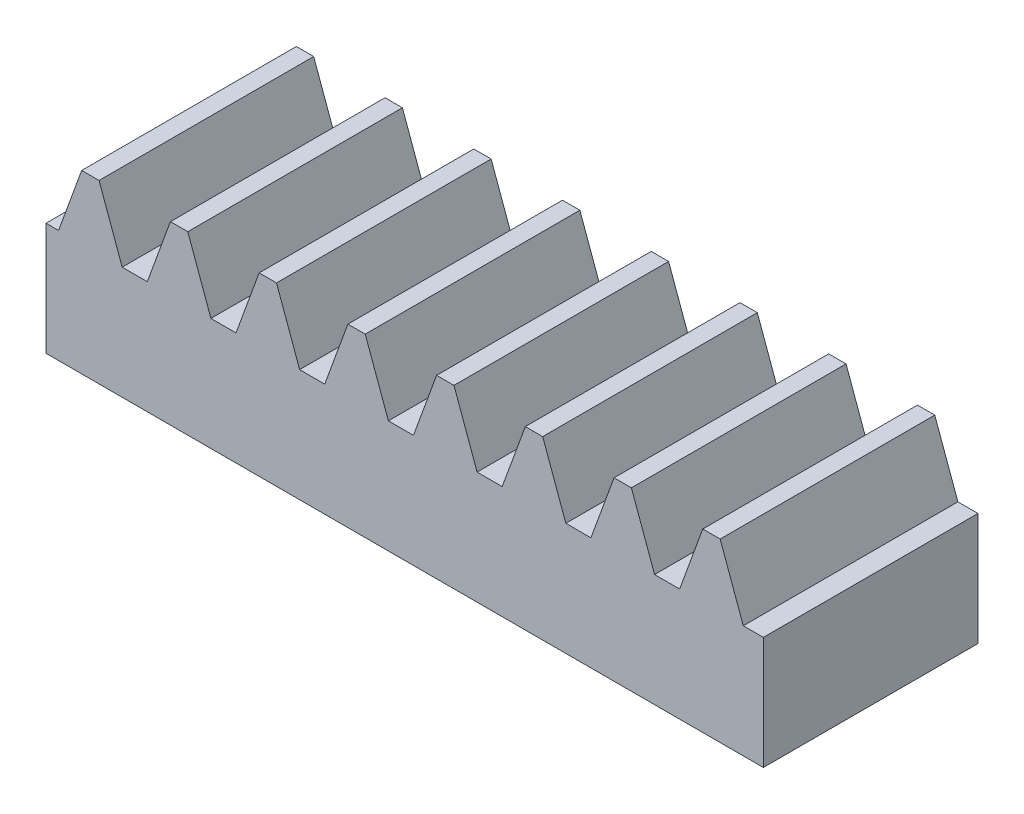
ISO-10303-21;
HEADER;
FILE_DESCRIPTION(('STEP AP214'),'2;1');
FILE_NAME('part.step','',(''),(''),'','','');
FILE_SCHEMA(('AUTOMOTIVE_DESIGN { 1 0 10303 214 1 1 1 1 }'));
ENDSEC;
DATA;
#1=APPLICATION_CONTEXT('core data for automotive mechanical design processes');
#2=APPLICATION_PROTOCOL_DEFINITION('international standard','automotive_design',2000,#1);
#3=PRODUCT_CONTEXT('',#1,'mechanical');
#4=PRODUCT('Part','Part','',(#3));
#5=PRODUCT_RELATED_PRODUCT_CATEGORY('part','',(#4));
#6=PRODUCT_DEFINITION_FORMATION('','',#4);
#7=PRODUCT_DEFINITION_CONTEXT('part definition',#1,'design');
#8=PRODUCT_DEFINITION('design','',#6,#7);
#9=PRODUCT_DEFINITION_SHAPE('','',#8);
#10=(LENGTH_UNIT() NAMED_UNIT(*) SI_UNIT(.MILLI.,.METRE.));
#11=(NAMED_UNIT(*) PLANE_ANGLE_UNIT() SI_UNIT($,.RADIAN.));
#12=(NAMED_UNIT(*) SI_UNIT($,.STERADIAN.) SOLID_ANGLE_UNIT());
#13=UNCERTAINTY_MEASURE_WITH_UNIT(LENGTH_MEASURE(1.E-05),#10,'distance_accuracy_value','');
#14=(GEOMETRIC_REPRESENTATION_CONTEXT(3) GLOBAL_UNCERTAINTY_ASSIGNED_CONTEXT((#13)) GLOBAL_UNIT_ASSIGNED_CONTEXT((#10,
#11,#12)) REPRESENTATION_CONTEXT('',''));
#15=CARTESIAN_POINT('',(0.,0.,0.));
#16=DIRECTION('',(0.,0.,1.));
#17=DIRECTION('',(1.,0.,0.));
#18=AXIS2_PLACEMENT_3D('',#15,#16,#17);
#19=CARTESIAN_POINT('',(0.,3.12,-3.8));
#20=DIRECTION('',(0.,1.,0.));
#21=DIRECTION('',(0.,0.,1.));
#22=AXIS2_PLACEMENT_3D('',#19,#20,#21);
#23=PLANE('',#22);
#24=DIRECTION('',(0.,0.,1.));
#25=VECTOR('',#24,1.);
#26=CARTESIAN_POINT('',(10.3638900766169,3.12,-3.8));
#27=LINE('',#26,#25);
#28=CARTESIAN_POINT('',(10.3638900766169,3.12,-3.8));
#29=VERTEX_POINT('',#28);
#30=CARTESIAN_POINT('',(10.3638900766169,3.12,0.));
#31=VERTEX_POINT('',#30);
#32=EDGE_CURVE('E310',#29,#31,#27,.T.);
#33=ORIENTED_EDGE('',*,*,#32,.F.);
#34=DIRECTION('',(-1.,0.,0.));
#35=VECTOR('',#34,1.);
#36=CARTESIAN_POINT('',(0.,3.12,-3.8));
#37=LINE('',#36,#35);
#38=CARTESIAN_POINT('',(10.0564621483831,3.12,-3.8));
#39=VERTEX_POINT('',#38);
#40=EDGE_CURVE('E485',#29,#39,#37,.T.);
#41=ORIENTED_EDGE('',*,*,#40,.T.);
#42=DIRECTION('',(0.,0.,-1.));
#43=VECTOR('',#42,1.);
#44=CARTESIAN_POINT('',(10.0564621483831,3.12,-3.8));
#45=LINE('',#44,#43);
#46=CARTESIAN_POINT('',(10.0564621483831,3.12,0.));
#47=VERTEX_POINT('',#46);
#48=EDGE_CURVE('E330',#47,#39,#45,.T.);
#49=ORIENTED_EDGE('',*,*,#48,.F.);
#50=DIRECTION('',(-1.,0.,0.));
#51=VECTOR('',#50,1.);
#52=CARTESIAN_POINT('',(0.,3.12,0.));
#53=LINE('',#52,#51);
#54=EDGE_CURVE('E495',#31,#47,#53,.T.);
#55=ORIENTED_EDGE('',*,*,#54,.F.);
#56=EDGE_LOOP('',(#33,#41,#49,#55));
#57=FACE_BOUND('',#56,.T.);
#58=ADVANCED_FACE('F33',(#57),#23,.T.);
#59=DIRECTION('',(0.,0.,1.));
#60=VECTOR('',#59,1.);
#61=CARTESIAN_POINT('',(8.79309375161691,3.12,-3.8));
#62=LINE('',#61,#60);
#63=CARTESIAN_POINT('',(8.79309375161691,3.12,-3.8));
#64=VERTEX_POINT('',#63);
#65=CARTESIAN_POINT('',(8.79309375161691,3.12,0.));
#66=VERTEX_POINT('',#65);
#67=EDGE_CURVE('E334',#64,#66,#62,.T.);
#68=ORIENTED_EDGE('',*,*,#67,.F.);
#69=CARTESIAN_POINT('',(8.4856658233831,3.12,-3.8));
#70=VERTEX_POINT('',#69);
#71=EDGE_CURVE('E575',#64,#70,#37,.T.);
#72=ORIENTED_EDGE('',*,*,#71,.T.);
#73=DIRECTION('',(0.,0.,-1.));
#74=VECTOR('',#73,1.);
#75=CARTESIAN_POINT('',(8.4856658233831,3.12,-3.8));
#76=LINE('',#75,#74);
#77=CARTESIAN_POINT('',(8.4856658233831,3.12,0.));
#78=VERTEX_POINT('',#77);
#79=EDGE_CURVE('E354',#78,#70,#76,.T.);
#80=ORIENTED_EDGE('',*,*,#79,.F.);
#81=EDGE_CURVE('E532',#66,#78,#53,.T.);
#82=ORIENTED_EDGE('',*,*,#81,.F.);
#83=EDGE_LOOP('',(#68,#72,#80,#82));
#84=FACE_BOUND('',#83,.T.);
#85=ADVANCED_FACE('F593',(#84),#23,.T.);
#86=DIRECTION('',(0.,0.,1.));
#87=VECTOR('',#86,1.);
#88=CARTESIAN_POINT('',(7.22229742661691,3.12,-3.8));
#89=LINE('',#88,#87);
#90=CARTESIAN_POINT('',(7.22229742661691,3.12,-3.8));
#91=VERTEX_POINT('',#90);
#92=CARTESIAN_POINT('',(7.22229742661691,3.12,0.));
#93=VERTEX_POINT('',#92);
#94=EDGE_CURVE('E358',#91,#93,#89,.T.);
#95=ORIENTED_EDGE('',*,*,#94,.F.);
#96=CARTESIAN_POINT('',(6.9148694983831,3.12,-3.8));
#97=VERTEX_POINT('',#96);
#98=EDGE_CURVE('E570',#91,#97,#37,.T.);
#99=ORIENTED_EDGE('',*,*,#98,.T.);
#100=DIRECTION('',(0.,0.,-1.));
#101=VECTOR('',#100,1.);
#102=CARTESIAN_POINT('',(6.9148694983831,3.12,-3.8));
#103=LINE('',#102,#101);
#104=CARTESIAN_POINT('',(6.9148694983831,3.12,0.));
#105=VERTEX_POINT('',#104);
#106=EDGE_CURVE('E378',#105,#97,#103,.T.);
#107=ORIENTED_EDGE('',*,*,#106,.F.);
#108=EDGE_CURVE('E533',#93,#105,#53,.T.);
#109=ORIENTED_EDGE('',*,*,#108,.F.);
#110=EDGE_LOOP('',(#95,#99,#107,#109));
#111=FACE_BOUND('',#110,.T.);
#112=ADVANCED_FACE('F603',(#111),#23,.T.);
#113=DIRECTION('',(0.,0.,1.));
#114=VECTOR('',#113,1.);
#115=CARTESIAN_POINT('',(5.65150110161691,3.12,-3.8));
#116=LINE('',#115,#114);
#117=CARTESIAN_POINT('',(5.65150110161691,3.12,-3.8));
#118=VERTEX_POINT('',#117);
#119=CARTESIAN_POINT('',(5.65150110161691,3.12,0.));
#120=VERTEX_POINT('',#119);
#121=EDGE_CURVE('E382',#118,#120,#116,.T.);
#122=ORIENTED_EDGE('',*,*,#121,.F.);
#123=CARTESIAN_POINT('',(5.3440731733831,3.12,-3.8));
#124=VERTEX_POINT('',#123);
#125=EDGE_CURVE('E565',#118,#124,#37,.T.);
#126=ORIENTED_EDGE('',*,*,#125,.T.);
#127=DIRECTION('',(0.,0.,-1.));
#128=VECTOR('',#127,1.);
#129=CARTESIAN_POINT('',(5.34407317338309,3.12,-3.8));
#130=LINE('',#129,#128);
#131=CARTESIAN_POINT('',(5.3440731733831,3.12,0.));
#132=VERTEX_POINT('',#131);
#133=EDGE_CURVE('E402',#132,#124,#130,.T.);
#134=ORIENTED_EDGE('',*,*,#133,.F.);
#135=EDGE_CURVE('E536',#120,#132,#53,.T.);
#136=ORIENTED_EDGE('',*,*,#135,.F.);
#137=EDGE_LOOP('',(#122,#126,#134,#136));
#138=FACE_BOUND('',#137,.T.);
#139=ADVANCED_FACE('F613',(#138),#23,.T.);
#140=DIRECTION('',(0.,0.,1.));
#141=VECTOR('',#140,1.);
#142=CARTESIAN_POINT('',(4.08070477661691,3.12,-3.8));
#143=LINE('',#142,#141);
#144=CARTESIAN_POINT('',(4.08070477661691,3.12,-3.8));
#145=VERTEX_POINT('',#144);
#146=CARTESIAN_POINT('',(4.08070477661691,3.12,0.));
#147=VERTEX_POINT('',#146);
#148=EDGE_CURVE('E406',#145,#147,#143,.T.);
#149=ORIENTED_EDGE('',*,*,#148,.F.);
#150=CARTESIAN_POINT('',(3.77327684838309,3.12,-3.8));
#151=VERTEX_POINT('',#150);
#152=EDGE_CURVE('E560',#145,#151,#37,.T.);
#153=ORIENTED_EDGE('',*,*,#152,.T.);
#154=DIRECTION('',(0.,0.,-1.));
#155=VECTOR('',#154,1.);
#156=CARTESIAN_POINT('',(3.77327684838309,3.12,-3.8));
#157=LINE('',#156,#155);
#158=CARTESIAN_POINT('',(3.77327684838309,3.12,0.));
#159=VERTEX_POINT('',#158);
#160=EDGE_CURVE('E426',#159,#151,#157,.T.);
#161=ORIENTED_EDGE('',*,*,#160,.F.);
#162=EDGE_CURVE('E539',#147,#159,#53,.T.);
#163=ORIENTED_EDGE('',*,*,#162,.F.);
#164=EDGE_LOOP('',(#149,#153,#161,#163));
#165=FACE_BOUND('',#164,.T.);
#166=ADVANCED_FACE('F623',(#165),#23,.T.);
#167=DIRECTION('',(0.,0.,1.));
#168=VECTOR('',#167,1.);
#169=CARTESIAN_POINT('',(2.50990845161691,3.12,-3.8));
#170=LINE('',#169,#168);
#171=CARTESIAN_POINT('',(2.50990845161691,3.12,-3.8));
#172=VERTEX_POINT('',#171);
#173=CARTESIAN_POINT('',(2.50990845161691,3.12,0.));
#174=VERTEX_POINT('',#173);
#175=EDGE_CURVE('E430',#172,#174,#170,.T.);
#176=ORIENTED_EDGE('',*,*,#175,.F.);
#177=CARTESIAN_POINT('',(2.20248052338309,3.12,-3.8));
#178=VERTEX_POINT('',#177);
#179=EDGE_CURVE('E559',#172,#178,#37,.T.);
#180=ORIENTED_EDGE('',*,*,#179,.T.);
#181=DIRECTION('',(0.,0.,-1.));
#182=VECTOR('',#181,1.);
#183=CARTESIAN_POINT('',(2.2024805233831,3.12,-3.8));
#184=LINE('',#183,#182);
#185=CARTESIAN_POINT('',(2.20248052338309,3.12,0.));
#186=VERTEX_POINT('',#185);
#187=EDGE_CURVE('E450',#186,#178,#184,.T.);
#188=ORIENTED_EDGE('',*,*,#187,.F.);
#189=EDGE_CURVE('E542',#174,#186,#53,.T.);
#190=ORIENTED_EDGE('',*,*,#189,.F.);
#191=EDGE_LOOP('',(#176,#180,#188,#190));
#192=FACE_BOUND('',#191,.T.);
#193=ADVANCED_FACE('F633',(#192),#23,.T.);
#194=DIRECTION('',(0.,0.,1.));
#195=VECTOR('',#194,1.);
#196=CARTESIAN_POINT('',(0.939112126616906,3.12,-3.8));
#197=LINE('',#196,#195);
#198=CARTESIAN_POINT('',(0.939112126616905,3.12,-3.8));
#199=VERTEX_POINT('',#198);
#200=CARTESIAN_POINT('',(0.939112126616905,3.12,0.));
#201=VERTEX_POINT('',#200);
#202=EDGE_CURVE('E454',#199,#201,#197,.T.);
#203=ORIENTED_EDGE('',*,*,#202,.F.);
#204=CARTESIAN_POINT('',(0.631684198383095,3.12,-3.8));
#205=VERTEX_POINT('',#204);
#206=EDGE_CURVE('E482',#199,#205,#37,.T.);
#207=ORIENTED_EDGE('',*,*,#206,.T.);
#208=DIRECTION('',(0.,0.,-1.));
#209=VECTOR('',#208,1.);
#210=CARTESIAN_POINT('',(0.631684198383095,3.12,-3.8));
#211=LINE('',#210,#209);
#212=CARTESIAN_POINT('',(0.631684198383095,3.12,0.));
#213=VERTEX_POINT('',#212);
#214=EDGE_CURVE('E470',#213,#205,#211,.T.);
#215=ORIENTED_EDGE('',*,*,#214,.F.);
#216=EDGE_CURVE('E493',#201,#213,#53,.T.);
#217=ORIENTED_EDGE('',*,*,#216,.F.);
#218=EDGE_LOOP('',(#203,#207,#215,#217));
#219=FACE_BOUND('',#218,.T.);
#220=ADVANCED_FACE('F557',(#219),#23,.T.);
#221=CARTESIAN_POINT('',(0.,0.,-3.8));
#222=DIRECTION('',(-1.,0.,0.));
#223=DIRECTION('',(0.,0.,1.));
#224=AXIS2_PLACEMENT_3D('',#221,#222,#223);
#225=PLANE('',#224);
#226=DIRECTION('',(0.,0.,1.));
#227=VECTOR('',#226,1.);
#228=CARTESIAN_POINT('',(0.,1.995,-3.8));
#229=LINE('',#228,#227);
#230=CARTESIAN_POINT('',(0.,1.995,-3.8));
#231=VERTEX_POINT('',#230);
#232=CARTESIAN_POINT('',(0.,1.995,0.));
#233=VERTEX_POINT('',#232);
#234=EDGE_CURVE('E468',#231,#233,#229,.T.);
#235=ORIENTED_EDGE('',*,*,#234,.F.);
#236=DIRECTION('',(0.,-1.,0.));
#237=VECTOR('',#236,1.);
#238=CARTESIAN_POINT('',(0.,0.,-3.8));
#239=LINE('',#238,#237);
#240=CARTESIAN_POINT('',(0.,0.,-3.8));
#241=VERTEX_POINT('',#240);
#242=EDGE_CURVE('E474',#231,#241,#239,.T.);
#243=ORIENTED_EDGE('',*,*,#242,.T.);
#244=DIRECTION('',(0.,0.,1.));
#245=VECTOR('',#244,1.);
#246=CARTESIAN_POINT('',(0.,0.,-3.8));
#247=LINE('',#246,#245);
#248=CARTESIAN_POINT('',(0.,0.,0.));
#249=VERTEX_POINT('',#248);
#250=EDGE_CURVE('E484',#241,#249,#247,.T.);
#251=ORIENTED_EDGE('',*,*,#250,.T.);
#252=DIRECTION('',(0.,-1.,0.));
#253=VECTOR('',#252,1.);
#254=CARTESIAN_POINT('',(0.,0.,0.));
#255=LINE('',#254,#253);
#256=EDGE_CURVE('E473',#233,#249,#255,.T.);
#257=ORIENTED_EDGE('',*,*,#256,.F.);
#258=EDGE_LOOP('',(#235,#243,#251,#257));
#259=FACE_BOUND('',#258,.T.);
#260=ADVANCED_FACE('F35',(#259),#225,.T.);
#261=DIRECTION('',(0.,0.,1.));
#262=VECTOR('',#261,1.);
#263=CARTESIAN_POINT('',(11.9346864016169,3.12,-3.8));
#264=LINE('',#263,#262);
#265=CARTESIAN_POINT('',(11.9346864016169,3.12,-3.8));
#266=VERTEX_POINT('',#265);
#267=CARTESIAN_POINT('',(11.9346864016169,3.12,0.));
#268=VERTEX_POINT('',#267);
#269=EDGE_CURVE('E289',#266,#268,#264,.T.);
#270=ORIENTED_EDGE('',*,*,#269,.F.);
#271=CARTESIAN_POINT('',(11.6272584733831,3.12,-3.8));
#272=VERTEX_POINT('',#271);
#273=EDGE_CURVE('E283',#266,#272,#37,.T.);
#274=ORIENTED_EDGE('',*,*,#273,.T.);
#275=DIRECTION('',(0.,0.,-1.));
#276=VECTOR('',#275,1.);
#277=CARTESIAN_POINT('',(11.6272584733831,3.12,-3.8));
#278=LINE('',#277,#276);
#279=CARTESIAN_POINT('',(11.6272584733831,3.12,0.));
#280=VERTEX_POINT('',#279);
#281=EDGE_CURVE('E306',#280,#272,#278,.T.);
#282=ORIENTED_EDGE('',*,*,#281,.F.);
#283=EDGE_CURVE('E477',#268,#280,#53,.T.);
#284=ORIENTED_EDGE('',*,*,#283,.F.);
#285=EDGE_LOOP('',(#270,#274,#282,#284));
#286=FACE_BOUND('',#285,.T.);
#287=ADVANCED_FACE('F656',(#286),#23,.T.);
#288=CARTESIAN_POINT('',(12.7,0.,-3.8));
#289=DIRECTION('',(1.,0.,0.));
#290=DIRECTION('',(0.,0.,-1.));
#291=AXIS2_PLACEMENT_3D('',#288,#289,#290);
#292=PLANE('',#291);
#293=DIRECTION('',(0.,0.,-1.));
#294=VECTOR('',#293,1.);
#295=CARTESIAN_POINT('',(12.7,1.995,-3.8));
#296=LINE('',#295,#294);
#297=CARTESIAN_POINT('',(12.7,1.995,0.));
#298=VERTEX_POINT('',#297);
#299=CARTESIAN_POINT('',(12.7,1.995,-3.8));
#300=VERTEX_POINT('',#299);
#301=EDGE_CURVE('E270',#298,#300,#296,.T.);
#302=ORIENTED_EDGE('',*,*,#301,.F.);
#303=DIRECTION('',(0.,1.,0.));
#304=VECTOR('',#303,1.);
#305=CARTESIAN_POINT('',(12.7,0.,0.));
#306=LINE('',#305,#304);
#307=CARTESIAN_POINT('',(12.7,0.,0.));
#308=VERTEX_POINT('',#307);
#309=EDGE_CURVE('E490',#308,#298,#306,.T.);
#310=ORIENTED_EDGE('',*,*,#309,.F.);
#311=DIRECTION('',(0.,0.,1.));
#312=VECTOR('',#311,1.);
#313=CARTESIAN_POINT('',(12.7,0.,-3.8));
#314=LINE('',#313,#312);
#315=CARTESIAN_POINT('',(12.7,0.,-3.8));
#316=VERTEX_POINT('',#315);
#317=EDGE_CURVE('E496',#316,#308,#314,.T.);
#318=ORIENTED_EDGE('',*,*,#317,.F.);
#319=DIRECTION('',(0.,1.,0.));
#320=VECTOR('',#319,1.);
#321=CARTESIAN_POINT('',(12.7,0.,-3.8));
#322=LINE('',#321,#320);
#323=EDGE_CURVE('E480',#316,#300,#322,.T.);
#324=ORIENTED_EDGE('',*,*,#323,.T.);
#325=EDGE_LOOP('',(#302,#310,#318,#324));
#326=FACE_BOUND('',#325,.T.);
#327=ADVANCED_FACE('F663',(#326),#292,.T.);
#328=CARTESIAN_POINT('',(0.,0.,-3.8));
#329=DIRECTION('',(0.,-1.,0.));
#330=DIRECTION('',(0.,0.,-1.));
#331=AXIS2_PLACEMENT_3D('',#328,#329,#330);
#332=PLANE('',#331);
#333=DIRECTION('',(1.,0.,0.));
#334=VECTOR('',#333,1.);
#335=CARTESIAN_POINT('',(0.,0.,0.));
#336=LINE('',#335,#334);
#337=EDGE_CURVE('E487',#249,#308,#336,.T.);
#338=ORIENTED_EDGE('',*,*,#337,.F.);
#339=ORIENTED_EDGE('',*,*,#250,.F.);
#340=DIRECTION('',(1.,0.,0.));
#341=VECTOR('',#340,1.);
#342=CARTESIAN_POINT('',(0.,0.,-3.8));
#343=LINE('',#342,#341);
#344=EDGE_CURVE('E476',#241,#316,#343,.T.);
#345=ORIENTED_EDGE('',*,*,#344,.T.);
#346=ORIENTED_EDGE('',*,*,#317,.T.);
#347=EDGE_LOOP('',(#338,#339,#345,#346));
#348=FACE_BOUND('',#347,.T.);
#349=ADVANCED_FACE('F669',(#348),#332,.T.);
#350=CARTESIAN_POINT('',(0.,3.12,-3.8));
#351=DIRECTION('',(0.,0.,-1.));
#352=DIRECTION('',(-1.,0.,0.));
#353=AXIS2_PLACEMENT_3D('',#350,#351,#352);
#354=PLANE('',#353);
#355=DIRECTION('',(0.342020143325663,-0.939692620785911,0.));
#356=VECTOR('',#355,1.);
#357=CARTESIAN_POINT('',(11.9254415576665,3.1454,-3.8));
#358=LINE('',#357,#356);
#359=CARTESIAN_POINT('',(12.3441529151664,1.995,-3.8));
#360=VERTEX_POINT('',#359);
#361=EDGE_CURVE('E267',#266,#360,#358,.T.);
#362=ORIENTED_EDGE('',*,*,#361,.T.);
#363=DIRECTION('',(1.,0.,0.));
#364=VECTOR('',#363,1.);
#365=CARTESIAN_POINT('',(12.7885882848336,1.995,-3.8));
#366=LINE('',#365,#364);
#367=EDGE_CURVE('E271',#360,#300,#366,.T.);
#368=ORIENTED_EDGE('',*,*,#367,.T.);
#369=ORIENTED_EDGE('',*,*,#323,.F.);
#370=ORIENTED_EDGE('',*,*,#344,.F.);
#371=ORIENTED_EDGE('',*,*,#242,.F.);
#372=DIRECTION('',(1.,0.,0.));
#373=VECTOR('',#372,1.);
#374=CARTESIAN_POINT('',(0.222217684833625,1.995,-3.8));
#375=LINE('',#374,#373);
#376=CARTESIAN_POINT('',(0.222217684833625,1.995,-3.8));
#377=VERTEX_POINT('',#376);
#378=EDGE_CURVE('E457',#231,#377,#375,.T.);
#379=ORIENTED_EDGE('',*,*,#378,.T.);
#380=DIRECTION('',(0.342020143325663,0.939692620785911,0.));
#381=VECTOR('',#380,1.);
#382=CARTESIAN_POINT('',(0.640929042333455,3.1454,-3.8));
#383=LINE('',#382,#381);
#384=EDGE_CURVE('E460',#377,#205,#383,.T.);
#385=ORIENTED_EDGE('',*,*,#384,.T.);
#386=ORIENTED_EDGE('',*,*,#206,.F.);
#387=DIRECTION('',(0.342020143325663,-0.939692620785911,0.));
#388=VECTOR('',#387,1.);
#389=CARTESIAN_POINT('',(0.929867282666545,3.1454,-3.8));
#390=LINE('',#389,#388);
#391=CARTESIAN_POINT('',(1.34857864016638,1.995,-3.8));
#392=VERTEX_POINT('',#391);
#393=EDGE_CURVE('E433',#199,#392,#390,.T.);
#394=ORIENTED_EDGE('',*,*,#393,.T.);
#395=DIRECTION('',(1.,0.,0.));
#396=VECTOR('',#395,1.);
#397=CARTESIAN_POINT('',(1.79301400983362,1.995,-3.8));
#398=LINE('',#397,#396);
#399=CARTESIAN_POINT('',(1.79301400983362,1.995,-3.8));
#400=VERTEX_POINT('',#399);
#401=EDGE_CURVE('E436',#392,#400,#398,.T.);
#402=ORIENTED_EDGE('',*,*,#401,.T.);
#403=DIRECTION('',(0.342020143325663,0.939692620785911,0.));
#404=VECTOR('',#403,1.);
#405=CARTESIAN_POINT('',(2.21172536733346,3.1454,-3.8));
#406=LINE('',#405,#404);
#407=EDGE_CURVE('E440',#400,#178,#406,.T.);
#408=ORIENTED_EDGE('',*,*,#407,.T.);
#409=ORIENTED_EDGE('',*,*,#179,.F.);
#410=DIRECTION('',(0.342020143325663,-0.939692620785911,0.));
#411=VECTOR('',#410,1.);
#412=CARTESIAN_POINT('',(2.50066360766654,3.1454,-3.8));
#413=LINE('',#412,#411);
#414=CARTESIAN_POINT('',(2.91937496516638,1.995,-3.8));
#415=VERTEX_POINT('',#414);
#416=EDGE_CURVE('E409',#172,#415,#413,.T.);
#417=ORIENTED_EDGE('',*,*,#416,.T.);
#418=DIRECTION('',(1.,0.,0.));
#419=VECTOR('',#418,1.);
#420=CARTESIAN_POINT('',(3.36381033483362,1.995,-3.8));
#421=LINE('',#420,#419);
#422=CARTESIAN_POINT('',(3.36381033483362,1.995,-3.8));
#423=VERTEX_POINT('',#422);
#424=EDGE_CURVE('E412',#415,#423,#421,.T.);
#425=ORIENTED_EDGE('',*,*,#424,.T.);
#426=DIRECTION('',(0.342020143325663,0.939692620785911,0.));
#427=VECTOR('',#426,1.);
#428=CARTESIAN_POINT('',(3.78252169233346,3.1454,-3.8));
#429=LINE('',#428,#427);
#430=EDGE_CURVE('E416',#423,#151,#429,.T.);
#431=ORIENTED_EDGE('',*,*,#430,.T.);
#432=ORIENTED_EDGE('',*,*,#152,.F.);
#433=DIRECTION('',(0.342020143325663,-0.939692620785911,0.));
#434=VECTOR('',#433,1.);
#435=CARTESIAN_POINT('',(4.07145993266654,3.1454,-3.8));
#436=LINE('',#435,#434);
#437=CARTESIAN_POINT('',(4.49017129016638,1.995,-3.8));
#438=VERTEX_POINT('',#437);
#439=EDGE_CURVE('E385',#145,#438,#436,.T.);
#440=ORIENTED_EDGE('',*,*,#439,.T.);
#441=DIRECTION('',(1.,0.,0.));
#442=VECTOR('',#441,1.);
#443=CARTESIAN_POINT('',(4.93460665983362,1.995,-3.8));
#444=LINE('',#443,#442);
#445=CARTESIAN_POINT('',(4.93460665983362,1.995,-3.8));
#446=VERTEX_POINT('',#445);
#447=EDGE_CURVE('E388',#438,#446,#444,.T.);
#448=ORIENTED_EDGE('',*,*,#447,.T.);
#449=DIRECTION('',(0.342020143325663,0.939692620785911,0.));
#450=VECTOR('',#449,1.);
#451=CARTESIAN_POINT('',(5.35331801733346,3.1454,-3.8));
#452=LINE('',#451,#450);
#453=EDGE_CURVE('E392',#446,#124,#452,.T.);
#454=ORIENTED_EDGE('',*,*,#453,.T.);
#455=ORIENTED_EDGE('',*,*,#125,.F.);
#456=DIRECTION('',(0.342020143325663,-0.939692620785911,0.));
#457=VECTOR('',#456,1.);
#458=CARTESIAN_POINT('',(5.64225625766655,3.1454,-3.8));
#459=LINE('',#458,#457);
#460=CARTESIAN_POINT('',(6.06096761516638,1.995,-3.8));
#461=VERTEX_POINT('',#460);
#462=EDGE_CURVE('E361',#118,#461,#459,.T.);
#463=ORIENTED_EDGE('',*,*,#462,.T.);
#464=DIRECTION('',(1.,0.,0.));
#465=VECTOR('',#464,1.);
#466=CARTESIAN_POINT('',(6.50540298483362,1.995,-3.8));
#467=LINE('',#466,#465);
#468=CARTESIAN_POINT('',(6.50540298483362,1.995,-3.8));
#469=VERTEX_POINT('',#468);
#470=EDGE_CURVE('E364',#461,#469,#467,.T.);
#471=ORIENTED_EDGE('',*,*,#470,.T.);
#472=DIRECTION('',(0.342020143325663,0.939692620785911,0.));
#473=VECTOR('',#472,1.);
#474=CARTESIAN_POINT('',(6.92411434233346,3.1454,-3.8));
#475=LINE('',#474,#473);
#476=EDGE_CURVE('E368',#469,#97,#475,.T.);
#477=ORIENTED_EDGE('',*,*,#476,.T.);
#478=ORIENTED_EDGE('',*,*,#98,.F.);
#479=DIRECTION('',(0.342020143325663,-0.939692620785911,0.));
#480=VECTOR('',#479,1.);
#481=CARTESIAN_POINT('',(7.21305258266655,3.1454,-3.8));
#482=LINE('',#481,#480);
#483=CARTESIAN_POINT('',(7.63176394016638,1.995,-3.8));
#484=VERTEX_POINT('',#483);
#485=EDGE_CURVE('E337',#91,#484,#482,.T.);
#486=ORIENTED_EDGE('',*,*,#485,.T.);
#487=DIRECTION('',(1.,0.,0.));
#488=VECTOR('',#487,1.);
#489=CARTESIAN_POINT('',(8.07619930983362,1.995,-3.8));
#490=LINE('',#489,#488);
#491=CARTESIAN_POINT('',(8.07619930983362,1.995,-3.8));
#492=VERTEX_POINT('',#491);
#493=EDGE_CURVE('E340',#484,#492,#490,.T.);
#494=ORIENTED_EDGE('',*,*,#493,.T.);
#495=DIRECTION('',(0.342020143325663,0.939692620785911,0.));
#496=VECTOR('',#495,1.);
#497=CARTESIAN_POINT('',(8.49491066733346,3.1454,-3.8));
#498=LINE('',#497,#496);
#499=EDGE_CURVE('E344',#492,#70,#498,.T.);
#500=ORIENTED_EDGE('',*,*,#499,.T.);
#501=ORIENTED_EDGE('',*,*,#71,.F.);
#502=DIRECTION('',(0.342020143325663,-0.939692620785911,0.));
#503=VECTOR('',#502,1.);
#504=CARTESIAN_POINT('',(8.78384890766655,3.1454,-3.8));
#505=LINE('',#504,#503);
#506=CARTESIAN_POINT('',(9.20256026516638,1.995,-3.8));
#507=VERTEX_POINT('',#506);
#508=EDGE_CURVE('E313',#64,#507,#505,.T.);
#509=ORIENTED_EDGE('',*,*,#508,.T.);
#510=DIRECTION('',(1.,0.,0.));
#511=VECTOR('',#510,1.);
#512=CARTESIAN_POINT('',(9.64699563483362,1.995,-3.8));
#513=LINE('',#512,#511);
#514=CARTESIAN_POINT('',(9.64699563483362,1.995,-3.8));
#515=VERTEX_POINT('',#514);
#516=EDGE_CURVE('E316',#507,#515,#513,.T.);
#517=ORIENTED_EDGE('',*,*,#516,.T.);
#518=DIRECTION('',(0.342020143325663,0.939692620785911,0.));
#519=VECTOR('',#518,1.);
#520=CARTESIAN_POINT('',(10.0657069923335,3.1454,-3.8));
#521=LINE('',#520,#519);
#522=EDGE_CURVE('E320',#515,#39,#521,.T.);
#523=ORIENTED_EDGE('',*,*,#522,.T.);
#524=ORIENTED_EDGE('',*,*,#40,.F.);
#525=DIRECTION('',(0.342020143325663,-0.939692620785911,0.));
#526=VECTOR('',#525,1.);
#527=CARTESIAN_POINT('',(10.3546452326665,3.1454,-3.8));
#528=LINE('',#527,#526);
#529=CARTESIAN_POINT('',(10.7733565901664,1.995,-3.8));
#530=VERTEX_POINT('',#529);
#531=EDGE_CURVE('E292',#29,#530,#528,.T.);
#532=ORIENTED_EDGE('',*,*,#531,.T.);
#533=DIRECTION('',(1.,0.,0.));
#534=VECTOR('',#533,1.);
#535=CARTESIAN_POINT('',(11.2177919598336,1.995,-3.8));
#536=LINE('',#535,#534);
#537=CARTESIAN_POINT('',(11.2177919598336,1.995,-3.8));
#538=VERTEX_POINT('',#537);
#539=EDGE_CURVE('E295',#530,#538,#536,.T.);
#540=ORIENTED_EDGE('',*,*,#539,.T.);
#541=DIRECTION('',(0.342020143325663,0.939692620785911,0.));
#542=VECTOR('',#541,1.);
#543=CARTESIAN_POINT('',(11.6365033173335,3.1454,-3.8));
#544=LINE('',#543,#542);
#545=EDGE_CURVE('E299',#538,#272,#544,.T.);
#546=ORIENTED_EDGE('',*,*,#545,.T.);
#547=ORIENTED_EDGE('',*,*,#273,.F.);
#548=EDGE_LOOP('',(#362,#368,#369,#370,#371,#379,#385,#386,#394,#402,#408,#409,#417,#425,#431,
#432,#440,#448,#454,#455,#463,#471,#477,#478,#486,#494,#500,#501,#509,#517,#523,#524,#532,#540,
#546,#547));
#549=FACE_BOUND('',#548,.T.);
#550=ADVANCED_FACE('F281',(#549),#354,.T.);
#551=CARTESIAN_POINT('',(0.,3.12,0.));
#552=DIRECTION('',(0.,0.,-1.));
#553=DIRECTION('',(-1.,0.,0.));
#554=AXIS2_PLACEMENT_3D('',#551,#552,#553);
#555=PLANE('',#554);
#556=DIRECTION('',(1.,0.,0.));
#557=VECTOR('',#556,1.);
#558=CARTESIAN_POINT('',(12.7885882848336,1.995,0.));
#559=LINE('',#558,#557);
#560=CARTESIAN_POINT('',(12.3441529151664,1.995,0.));
#561=VERTEX_POINT('',#560);
#562=EDGE_CURVE('E284',#561,#298,#559,.T.);
#563=ORIENTED_EDGE('',*,*,#562,.F.);
#564=DIRECTION('',(-0.342020143325663,0.939692620785911,0.));
#565=VECTOR('',#564,1.);
#566=CARTESIAN_POINT('',(10.5385932999716,6.95573427222683,0.));
#567=LINE('',#566,#565);
#568=EDGE_CURVE('E11',#561,#268,#567,.T.);
#569=ORIENTED_EDGE('',*,*,#568,.T.);
#570=ORIENTED_EDGE('',*,*,#283,.T.);
#571=DIRECTION('',(0.342020143325663,0.939692620785911,0.));
#572=VECTOR('',#571,1.);
#573=CARTESIAN_POINT('',(11.6365033173335,3.1454,0.));
#574=LINE('',#573,#572);
#575=CARTESIAN_POINT('',(11.2177919598336,1.995,0.));
#576=VERTEX_POINT('',#575);
#577=EDGE_CURVE('E296',#576,#280,#574,.T.);
#578=ORIENTED_EDGE('',*,*,#577,.F.);
#579=DIRECTION('',(1.,0.,0.));
#580=VECTOR('',#579,1.);
#581=CARTESIAN_POINT('',(11.2177919598336,1.995,0.));
#582=LINE('',#581,#580);
#583=CARTESIAN_POINT('',(10.7733565901664,1.995,0.));
#584=VERTEX_POINT('',#583);
#585=EDGE_CURVE('E291',#584,#576,#582,.T.);
#586=ORIENTED_EDGE('',*,*,#585,.F.);
#587=DIRECTION('',(-0.342020143325663,0.939692620785911,0.));
#588=VECTOR('',#587,1.);
#589=CARTESIAN_POINT('',(9.15154523945264,6.45089006470126,0.));
#590=LINE('',#589,#588);
#591=EDGE_CURVE('E41',#584,#31,#590,.T.);
#592=ORIENTED_EDGE('',*,*,#591,.T.);
#593=ORIENTED_EDGE('',*,*,#54,.T.);
#594=DIRECTION('',(0.342020143325663,0.939692620785911,0.));
#595=VECTOR('',#594,1.);
#596=CARTESIAN_POINT('',(10.0657069923335,3.1454,0.));
#597=LINE('',#596,#595);
#598=CARTESIAN_POINT('',(9.64699563483362,1.995,0.));
#599=VERTEX_POINT('',#598);
#600=EDGE_CURVE('E317',#599,#47,#597,.T.);
#601=ORIENTED_EDGE('',*,*,#600,.F.);
#602=DIRECTION('',(1.,0.,0.));
#603=VECTOR('',#602,1.);
#604=CARTESIAN_POINT('',(9.64699563483362,1.995,0.));
#605=LINE('',#604,#603);
#606=CARTESIAN_POINT('',(9.20256026516638,1.995,0.));
#607=VERTEX_POINT('',#606);
#608=EDGE_CURVE('E312',#607,#599,#605,.T.);
#609=ORIENTED_EDGE('',*,*,#608,.F.);
#610=DIRECTION('',(-0.342020143325663,0.939692620785911,0.));
#611=VECTOR('',#610,1.);
#612=CARTESIAN_POINT('',(7.76449717893366,5.9460458571757,0.));
#613=LINE('',#612,#611);
#614=EDGE_CURVE('E518',#607,#66,#613,.T.);
#615=ORIENTED_EDGE('',*,*,#614,.T.);
#616=ORIENTED_EDGE('',*,*,#81,.T.);
#617=DIRECTION('',(0.342020143325663,0.939692620785911,0.));
#618=VECTOR('',#617,1.);
#619=CARTESIAN_POINT('',(8.49491066733346,3.1454,0.));
#620=LINE('',#619,#618);
#621=CARTESIAN_POINT('',(8.07619930983362,1.995,0.));
#622=VERTEX_POINT('',#621);
#623=EDGE_CURVE('E341',#622,#78,#620,.T.);
#624=ORIENTED_EDGE('',*,*,#623,.F.);
#625=DIRECTION('',(1.,0.,0.));
#626=VECTOR('',#625,1.);
#627=CARTESIAN_POINT('',(8.07619930983362,1.995,0.));
#628=LINE('',#627,#626);
#629=CARTESIAN_POINT('',(7.63176394016638,1.995,0.));
#630=VERTEX_POINT('',#629);
#631=EDGE_CURVE('E336',#630,#622,#628,.T.);
#632=ORIENTED_EDGE('',*,*,#631,.F.);
#633=DIRECTION('',(-0.342020143325663,0.939692620785911,0.));
#634=VECTOR('',#633,1.);
#635=CARTESIAN_POINT('',(6.37744911841467,5.44120164965013,0.));
#636=LINE('',#635,#634);
#637=EDGE_CURVE('E515',#630,#93,#636,.T.);
#638=ORIENTED_EDGE('',*,*,#637,.T.);
#639=ORIENTED_EDGE('',*,*,#108,.T.);
#640=DIRECTION('',(0.342020143325663,0.939692620785911,0.));
#641=VECTOR('',#640,1.);
#642=CARTESIAN_POINT('',(6.92411434233346,3.1454,0.));
#643=LINE('',#642,#641);
#644=CARTESIAN_POINT('',(6.50540298483362,1.995,0.));
#645=VERTEX_POINT('',#644);
#646=EDGE_CURVE('E365',#645,#105,#643,.T.);
#647=ORIENTED_EDGE('',*,*,#646,.F.);
#648=DIRECTION('',(1.,0.,0.));
#649=VECTOR('',#648,1.);
#650=CARTESIAN_POINT('',(6.50540298483362,1.995,0.));
#651=LINE('',#650,#649);
#652=CARTESIAN_POINT('',(6.06096761516638,1.995,0.));
#653=VERTEX_POINT('',#652);
#654=EDGE_CURVE('E360',#653,#645,#651,.T.);
#655=ORIENTED_EDGE('',*,*,#654,.F.);
#656=DIRECTION('',(-0.342020143325663,0.939692620785911,0.));
#657=VECTOR('',#656,1.);
#658=CARTESIAN_POINT('',(4.99040105789568,4.93635744212456,0.));
#659=LINE('',#658,#657);
#660=EDGE_CURVE('E512',#653,#120,#659,.T.);
#661=ORIENTED_EDGE('',*,*,#660,.T.);
#662=ORIENTED_EDGE('',*,*,#135,.T.);
#663=DIRECTION('',(0.342020143325663,0.939692620785911,0.));
#664=VECTOR('',#663,1.);
#665=CARTESIAN_POINT('',(5.35331801733346,3.1454,0.));
#666=LINE('',#665,#664);
#667=CARTESIAN_POINT('',(4.93460665983362,1.995,0.));
#668=VERTEX_POINT('',#667);
#669=EDGE_CURVE('E389',#668,#132,#666,.T.);
#670=ORIENTED_EDGE('',*,*,#669,.F.);
#671=DIRECTION('',(1.,0.,0.));
#672=VECTOR('',#671,1.);
#673=CARTESIAN_POINT('',(4.93460665983362,1.995,0.));
#674=LINE('',#673,#672);
#675=CARTESIAN_POINT('',(4.49017129016638,1.995,0.));
#676=VERTEX_POINT('',#675);
#677=EDGE_CURVE('E384',#676,#668,#674,.T.);
#678=ORIENTED_EDGE('',*,*,#677,.F.);
#679=DIRECTION('',(-0.342020143325663,0.939692620785911,0.));
#680=VECTOR('',#679,1.);
#681=CARTESIAN_POINT('',(3.60335299737669,4.43151323459899,0.));
#682=LINE('',#681,#680);
#683=EDGE_CURVE('E509',#676,#147,#682,.T.);
#684=ORIENTED_EDGE('',*,*,#683,.T.);
#685=ORIENTED_EDGE('',*,*,#162,.T.);
#686=DIRECTION('',(0.342020143325663,0.939692620785911,0.));
#687=VECTOR('',#686,1.);
#688=CARTESIAN_POINT('',(3.78252169233346,3.1454,0.));
#689=LINE('',#688,#687);
#690=CARTESIAN_POINT('',(3.36381033483362,1.995,0.));
#691=VERTEX_POINT('',#690);
#692=EDGE_CURVE('E413',#691,#159,#689,.T.);
#693=ORIENTED_EDGE('',*,*,#692,.F.);
#694=DIRECTION('',(1.,0.,0.));
#695=VECTOR('',#694,1.);
#696=CARTESIAN_POINT('',(3.36381033483362,1.995,0.));
#697=LINE('',#696,#695);
#698=CARTESIAN_POINT('',(2.91937496516638,1.995,0.));
#699=VERTEX_POINT('',#698);
#700=EDGE_CURVE('E408',#699,#691,#697,.T.);
#701=ORIENTED_EDGE('',*,*,#700,.F.);
#702=DIRECTION('',(-0.342020143325663,0.939692620785911,0.));
#703=VECTOR('',#702,1.);
#704=CARTESIAN_POINT('',(2.21630493685771,3.92666902707343,0.));
#705=LINE('',#704,#703);
#706=EDGE_CURVE('E506',#699,#174,#705,.T.);
#707=ORIENTED_EDGE('',*,*,#706,.T.);
#708=ORIENTED_EDGE('',*,*,#189,.T.);
#709=DIRECTION('',(0.342020143325663,0.939692620785911,0.));
#710=VECTOR('',#709,1.);
#711=CARTESIAN_POINT('',(2.21172536733346,3.1454,0.));
#712=LINE('',#711,#710);
#713=CARTESIAN_POINT('',(1.79301400983362,1.995,0.));
#714=VERTEX_POINT('',#713);
#715=EDGE_CURVE('E437',#714,#186,#712,.T.);
#716=ORIENTED_EDGE('',*,*,#715,.F.);
#717=DIRECTION('',(1.,0.,0.));
#718=VECTOR('',#717,1.);
#719=CARTESIAN_POINT('',(1.79301400983362,1.995,0.));
#720=LINE('',#719,#718);
#721=CARTESIAN_POINT('',(1.34857864016638,1.995,0.));
#722=VERTEX_POINT('',#721);
#723=EDGE_CURVE('E432',#722,#714,#720,.T.);
#724=ORIENTED_EDGE('',*,*,#723,.F.);
#725=DIRECTION('',(-0.342020143325663,0.939692620785911,0.));
#726=VECTOR('',#725,1.);
#727=CARTESIAN_POINT('',(0.82925687633872,3.42182481954786,0.));
#728=LINE('',#727,#726);
#729=EDGE_CURVE('E503',#722,#201,#728,.T.);
#730=ORIENTED_EDGE('',*,*,#729,.T.);
#731=ORIENTED_EDGE('',*,*,#216,.T.);
#732=DIRECTION('',(0.342020143325663,0.939692620785911,0.));
#733=VECTOR('',#732,1.);
#734=CARTESIAN_POINT('',(0.640929042333455,3.1454,0.));
#735=LINE('',#734,#733);
#736=CARTESIAN_POINT('',(0.222217684833625,1.995,0.));
#737=VERTEX_POINT('',#736);
#738=EDGE_CURVE('E456',#737,#213,#735,.T.);
#739=ORIENTED_EDGE('',*,*,#738,.F.);
#740=DIRECTION('',(-1.,0.,0.));
#741=VECTOR('',#740,1.);
#742=CARTESIAN_POINT('',(0.,1.995,0.));
#743=LINE('',#742,#741);
#744=EDGE_CURVE('E498',#737,#233,#743,.T.);
#745=ORIENTED_EDGE('',*,*,#744,.T.);
#746=ORIENTED_EDGE('',*,*,#256,.T.);
#747=ORIENTED_EDGE('',*,*,#337,.T.);
#748=ORIENTED_EDGE('',*,*,#309,.T.);
#749=EDGE_LOOP('',(#563,#569,#570,#578,#586,#592,#593,#601,#609,#615,#616,#624,#632,#638,#639,
#647,#655,#661,#662,#670,#678,#684,#685,#693,#701,#707,#708,#716,#724,#730,#731,#739,#745,#746,
#747,#748));
#750=FACE_BOUND('',#749,.T.);
#751=ADVANCED_FACE('F524',(#750),#555,.F.);
#752=CARTESIAN_POINT('',(0.640929042333455,3.1454,-3.8));
#753=DIRECTION('',(0.93969262078591,-0.342020143325663,0.));
#754=DIRECTION('',(0.342020143325663,0.939692620785911,0.));
#755=AXIS2_PLACEMENT_3D('',#752,#753,#754);
#756=PLANE('',#755);
#757=ORIENTED_EDGE('',*,*,#214,.T.);
#758=ORIENTED_EDGE('',*,*,#384,.F.);
#759=DIRECTION('',(0.,0.,1.));
#760=VECTOR('',#759,1.);
#761=CARTESIAN_POINT('',(0.222217684833625,1.995,-3.8));
#762=LINE('',#761,#760);
#763=EDGE_CURVE('E463',#377,#737,#762,.T.);
#764=ORIENTED_EDGE('',*,*,#763,.T.);
#765=ORIENTED_EDGE('',*,*,#738,.T.);
#766=EDGE_LOOP('',(#757,#758,#764,#765));
#767=FACE_BOUND('',#766,.T.);
#768=ADVANCED_FACE('F555',(#767),#756,.F.);
#769=CARTESIAN_POINT('',(0.222217684833625,1.995,-3.8));
#770=DIRECTION('',(0.,-1.,0.));
#771=DIRECTION('',(0.,0.,-1.));
#772=AXIS2_PLACEMENT_3D('',#769,#770,#771);
#773=PLANE('',#772);
#774=ORIENTED_EDGE('',*,*,#234,.T.);
#775=ORIENTED_EDGE('',*,*,#744,.F.);
#776=ORIENTED_EDGE('',*,*,#763,.F.);
#777=ORIENTED_EDGE('',*,*,#378,.F.);
#778=EDGE_LOOP('',(#774,#775,#776,#777));
#779=FACE_BOUND('',#778,.T.);
#780=ADVANCED_FACE('F643',(#779),#773,.F.);
#781=CARTESIAN_POINT('',(0.929867282666545,3.1454,-3.8));
#782=DIRECTION('',(-0.93969262078591,-0.342020143325663,0.));
#783=DIRECTION('',(0.342020143325663,-0.939692620785911,0.));
#784=AXIS2_PLACEMENT_3D('',#781,#782,#783);
#785=PLANE('',#784);
#786=ORIENTED_EDGE('',*,*,#202,.T.);
#787=ORIENTED_EDGE('',*,*,#729,.F.);
#788=DIRECTION('',(0.,0.,1.));
#789=VECTOR('',#788,1.);
#790=CARTESIAN_POINT('',(1.34857864016638,1.995,-3.8));
#791=LINE('',#790,#789);
#792=EDGE_CURVE('E443',#392,#722,#791,.T.);
#793=ORIENTED_EDGE('',*,*,#792,.F.);
#794=ORIENTED_EDGE('',*,*,#393,.F.);
#795=EDGE_LOOP('',(#786,#787,#793,#794));
#796=FACE_BOUND('',#795,.T.);
#797=ADVANCED_FACE('F641',(#796),#785,.F.);
#798=CARTESIAN_POINT('',(2.21172536733346,3.1454,-3.8));
#799=DIRECTION('',(0.93969262078591,-0.342020143325663,0.));
#800=DIRECTION('',(0.342020143325663,0.939692620785911,0.));
#801=AXIS2_PLACEMENT_3D('',#798,#799,#800);
#802=PLANE('',#801);
#803=ORIENTED_EDGE('',*,*,#187,.T.);
#804=ORIENTED_EDGE('',*,*,#407,.F.);
#805=DIRECTION('',(0.,0.,1.));
#806=VECTOR('',#805,1.);
#807=CARTESIAN_POINT('',(1.79301400983362,1.995,-3.8));
#808=LINE('',#807,#806);
#809=EDGE_CURVE('E448',#400,#714,#808,.T.);
#810=ORIENTED_EDGE('',*,*,#809,.T.);
#811=ORIENTED_EDGE('',*,*,#715,.T.);
#812=EDGE_LOOP('',(#803,#804,#810,#811));
#813=FACE_BOUND('',#812,.T.);
#814=ADVANCED_FACE('F636',(#813),#802,.F.);
#815=CARTESIAN_POINT('',(1.79301400983362,1.995,-3.8));
#816=DIRECTION('',(0.,-1.,0.));
#817=DIRECTION('',(0.,0.,-1.));
#818=AXIS2_PLACEMENT_3D('',#815,#816,#817);
#819=PLANE('',#818);
#820=ORIENTED_EDGE('',*,*,#723,.T.);
#821=ORIENTED_EDGE('',*,*,#809,.F.);
#822=ORIENTED_EDGE('',*,*,#401,.F.);
#823=ORIENTED_EDGE('',*,*,#792,.T.);
#824=EDGE_LOOP('',(#820,#821,#822,#823));
#825=FACE_BOUND('',#824,.T.);
#826=ADVANCED_FACE('F639',(#825),#819,.F.);
#827=CARTESIAN_POINT('',(2.50066360766654,3.1454,-3.8));
#828=DIRECTION('',(-0.93969262078591,-0.342020143325663,0.));
#829=DIRECTION('',(0.342020143325663,-0.939692620785911,0.));
#830=AXIS2_PLACEMENT_3D('',#827,#828,#829);
#831=PLANE('',#830);
#832=ORIENTED_EDGE('',*,*,#175,.T.);
#833=ORIENTED_EDGE('',*,*,#706,.F.);
#834=DIRECTION('',(0.,0.,1.));
#835=VECTOR('',#834,1.);
#836=CARTESIAN_POINT('',(2.91937496516638,1.995,-3.8));
#837=LINE('',#836,#835);
#838=EDGE_CURVE('E419',#415,#699,#837,.T.);
#839=ORIENTED_EDGE('',*,*,#838,.F.);
#840=ORIENTED_EDGE('',*,*,#416,.F.);
#841=EDGE_LOOP('',(#832,#833,#839,#840));
#842=FACE_BOUND('',#841,.T.);
#843=ADVANCED_FACE('F759',(#842),#831,.F.);
#844=CARTESIAN_POINT('',(3.78252169233346,3.1454,-3.8));
#845=DIRECTION('',(0.93969262078591,-0.342020143325663,0.));
#846=DIRECTION('',(0.342020143325663,0.939692620785911,0.));
#847=AXIS2_PLACEMENT_3D('',#844,#845,#846);
#848=PLANE('',#847);
#849=ORIENTED_EDGE('',*,*,#160,.T.);
#850=ORIENTED_EDGE('',*,*,#430,.F.);
#851=DIRECTION('',(0.,0.,1.));
#852=VECTOR('',#851,1.);
#853=CARTESIAN_POINT('',(3.36381033483362,1.995,-3.8));
#854=LINE('',#853,#852);
#855=EDGE_CURVE('E424',#423,#691,#854,.T.);
#856=ORIENTED_EDGE('',*,*,#855,.T.);
#857=ORIENTED_EDGE('',*,*,#692,.T.);
#858=EDGE_LOOP('',(#849,#850,#856,#857));
#859=FACE_BOUND('',#858,.T.);
#860=ADVANCED_FACE('F626',(#859),#848,.F.);
#861=CARTESIAN_POINT('',(3.36381033483362,1.995,-3.8));
#862=DIRECTION('',(0.,-1.,0.));
#863=DIRECTION('',(0.,0.,-1.));
#864=AXIS2_PLACEMENT_3D('',#861,#862,#863);
#865=PLANE('',#864);
#866=ORIENTED_EDGE('',*,*,#700,.T.);
#867=ORIENTED_EDGE('',*,*,#855,.F.);
#868=ORIENTED_EDGE('',*,*,#424,.F.);
#869=ORIENTED_EDGE('',*,*,#838,.T.);
#870=EDGE_LOOP('',(#866,#867,#868,#869));
#871=FACE_BOUND('',#870,.T.);
#872=ADVANCED_FACE('F629',(#871),#865,.F.);
#873=CARTESIAN_POINT('',(4.07145993266654,3.1454,-3.8));
#874=DIRECTION('',(-0.93969262078591,-0.342020143325663,0.));
#875=DIRECTION('',(0.342020143325663,-0.939692620785911,0.));
#876=AXIS2_PLACEMENT_3D('',#873,#874,#875);
#877=PLANE('',#876);
#878=ORIENTED_EDGE('',*,*,#148,.T.);
#879=ORIENTED_EDGE('',*,*,#683,.F.);
#880=DIRECTION('',(0.,0.,1.));
#881=VECTOR('',#880,1.);
#882=CARTESIAN_POINT('',(4.49017129016638,1.995,-3.8));
#883=LINE('',#882,#881);
#884=EDGE_CURVE('E395',#438,#676,#883,.T.);
#885=ORIENTED_EDGE('',*,*,#884,.F.);
#886=ORIENTED_EDGE('',*,*,#439,.F.);
#887=EDGE_LOOP('',(#878,#879,#885,#886));
#888=FACE_BOUND('',#887,.T.);
#889=ADVANCED_FACE('F783',(#888),#877,.F.);
#890=CARTESIAN_POINT('',(5.35331801733346,3.1454,-3.8));
#891=DIRECTION('',(0.93969262078591,-0.342020143325663,0.));
#892=DIRECTION('',(0.342020143325663,0.939692620785911,0.));
#893=AXIS2_PLACEMENT_3D('',#890,#891,#892);
#894=PLANE('',#893);
#895=ORIENTED_EDGE('',*,*,#133,.T.);
#896=ORIENTED_EDGE('',*,*,#453,.F.);
#897=DIRECTION('',(0.,0.,1.));
#898=VECTOR('',#897,1.);
#899=CARTESIAN_POINT('',(4.93460665983362,1.995,-3.8));
#900=LINE('',#899,#898);
#901=EDGE_CURVE('E400',#446,#668,#900,.T.);
#902=ORIENTED_EDGE('',*,*,#901,.T.);
#903=ORIENTED_EDGE('',*,*,#669,.T.);
#904=EDGE_LOOP('',(#895,#896,#902,#903));
#905=FACE_BOUND('',#904,.T.);
#906=ADVANCED_FACE('F616',(#905),#894,.F.);
#907=CARTESIAN_POINT('',(4.93460665983362,1.995,-3.8));
#908=DIRECTION('',(0.,-1.,0.));
#909=DIRECTION('',(0.,0.,-1.));
#910=AXIS2_PLACEMENT_3D('',#907,#908,#909);
#911=PLANE('',#910);
#912=ORIENTED_EDGE('',*,*,#677,.T.);
#913=ORIENTED_EDGE('',*,*,#901,.F.);
#914=ORIENTED_EDGE('',*,*,#447,.F.);
#915=ORIENTED_EDGE('',*,*,#884,.T.);
#916=EDGE_LOOP('',(#912,#913,#914,#915));
#917=FACE_BOUND('',#916,.T.);
#918=ADVANCED_FACE('F619',(#917),#911,.F.);
#919=CARTESIAN_POINT('',(5.64225625766655,3.1454,-3.8));
#920=DIRECTION('',(-0.93969262078591,-0.342020143325663,0.));
#921=DIRECTION('',(0.342020143325663,-0.939692620785911,0.));
#922=AXIS2_PLACEMENT_3D('',#919,#920,#921);
#923=PLANE('',#922);
#924=ORIENTED_EDGE('',*,*,#121,.T.);
#925=ORIENTED_EDGE('',*,*,#660,.F.);
#926=DIRECTION('',(0.,0.,1.));
#927=VECTOR('',#926,1.);
#928=CARTESIAN_POINT('',(6.06096761516638,1.995,-3.8));
#929=LINE('',#928,#927);
#930=EDGE_CURVE('E371',#461,#653,#929,.T.);
#931=ORIENTED_EDGE('',*,*,#930,.F.);
#932=ORIENTED_EDGE('',*,*,#462,.F.);
#933=EDGE_LOOP('',(#924,#925,#931,#932));
#934=FACE_BOUND('',#933,.T.);
#935=ADVANCED_FACE('F808',(#934),#923,.F.);
#936=CARTESIAN_POINT('',(6.92411434233346,3.1454,-3.8));
#937=DIRECTION('',(0.93969262078591,-0.342020143325663,0.));
#938=DIRECTION('',(0.342020143325663,0.939692620785911,0.));
#939=AXIS2_PLACEMENT_3D('',#936,#937,#938);
#940=PLANE('',#939);
#941=ORIENTED_EDGE('',*,*,#106,.T.);
#942=ORIENTED_EDGE('',*,*,#476,.F.);
#943=DIRECTION('',(0.,0.,1.));
#944=VECTOR('',#943,1.);
#945=CARTESIAN_POINT('',(6.50540298483362,1.995,-3.8));
#946=LINE('',#945,#944);
#947=EDGE_CURVE('E376',#469,#645,#946,.T.);
#948=ORIENTED_EDGE('',*,*,#947,.T.);
#949=ORIENTED_EDGE('',*,*,#646,.T.);
#950=EDGE_LOOP('',(#941,#942,#948,#949));
#951=FACE_BOUND('',#950,.T.);
#952=ADVANCED_FACE('F606',(#951),#940,.F.);
#953=CARTESIAN_POINT('',(6.50540298483362,1.995,-3.8));
#954=DIRECTION('',(0.,-1.,0.));
#955=DIRECTION('',(0.,0.,-1.));
#956=AXIS2_PLACEMENT_3D('',#953,#954,#955);
#957=PLANE('',#956);
#958=ORIENTED_EDGE('',*,*,#654,.T.);
#959=ORIENTED_EDGE('',*,*,#947,.F.);
#960=ORIENTED_EDGE('',*,*,#470,.F.);
#961=ORIENTED_EDGE('',*,*,#930,.T.);
#962=EDGE_LOOP('',(#958,#959,#960,#961));
#963=FACE_BOUND('',#962,.T.);
#964=ADVANCED_FACE('F609',(#963),#957,.F.);
#965=CARTESIAN_POINT('',(7.21305258266655,3.1454,-3.8));
#966=DIRECTION('',(-0.93969262078591,-0.342020143325663,0.));
#967=DIRECTION('',(0.342020143325663,-0.939692620785911,0.));
#968=AXIS2_PLACEMENT_3D('',#965,#966,#967);
#969=PLANE('',#968);
#970=ORIENTED_EDGE('',*,*,#94,.T.);
#971=ORIENTED_EDGE('',*,*,#637,.F.);
#972=DIRECTION('',(0.,0.,1.));
#973=VECTOR('',#972,1.);
#974=CARTESIAN_POINT('',(7.63176394016638,1.995,-3.8));
#975=LINE('',#974,#973);
#976=EDGE_CURVE('E347',#484,#630,#975,.T.);
#977=ORIENTED_EDGE('',*,*,#976,.F.);
#978=ORIENTED_EDGE('',*,*,#485,.F.);
#979=EDGE_LOOP('',(#970,#971,#977,#978));
#980=FACE_BOUND('',#979,.T.);
#981=ADVANCED_FACE('F833',(#980),#969,.F.);
#982=CARTESIAN_POINT('',(8.49491066733346,3.1454,-3.8));
#983=DIRECTION('',(0.93969262078591,-0.342020143325663,0.));
#984=DIRECTION('',(0.342020143325663,0.939692620785911,0.));
#985=AXIS2_PLACEMENT_3D('',#982,#983,#984);
#986=PLANE('',#985);
#987=ORIENTED_EDGE('',*,*,#79,.T.);
#988=ORIENTED_EDGE('',*,*,#499,.F.);
#989=DIRECTION('',(0.,0.,1.));
#990=VECTOR('',#989,1.);
#991=CARTESIAN_POINT('',(8.07619930983362,1.995,-3.8));
#992=LINE('',#991,#990);
#993=EDGE_CURVE('E352',#492,#622,#992,.T.);
#994=ORIENTED_EDGE('',*,*,#993,.T.);
#995=ORIENTED_EDGE('',*,*,#623,.T.);
#996=EDGE_LOOP('',(#987,#988,#994,#995));
#997=FACE_BOUND('',#996,.T.);
#998=ADVANCED_FACE('F596',(#997),#986,.F.);
#999=CARTESIAN_POINT('',(8.07619930983362,1.995,-3.8));
#1000=DIRECTION('',(0.,-1.,0.));
#1001=DIRECTION('',(0.,0.,-1.));
#1002=AXIS2_PLACEMENT_3D('',#999,#1000,#1001);
#1003=PLANE('',#1002);
#1004=ORIENTED_EDGE('',*,*,#631,.T.);
#1005=ORIENTED_EDGE('',*,*,#993,.F.);
#1006=ORIENTED_EDGE('',*,*,#493,.F.);
#1007=ORIENTED_EDGE('',*,*,#976,.T.);
#1008=EDGE_LOOP('',(#1004,#1005,#1006,#1007));
#1009=FACE_BOUND('',#1008,.T.);
#1010=ADVANCED_FACE('F599',(#1009),#1003,.F.);
#1011=CARTESIAN_POINT('',(8.78384890766655,3.1454,-3.8));
#1012=DIRECTION('',(-0.93969262078591,-0.342020143325663,0.));
#1013=DIRECTION('',(0.342020143325663,-0.939692620785911,0.));
#1014=AXIS2_PLACEMENT_3D('',#1011,#1012,#1013);
#1015=PLANE('',#1014);
#1016=ORIENTED_EDGE('',*,*,#67,.T.);
#1017=ORIENTED_EDGE('',*,*,#614,.F.);
#1018=DIRECTION('',(0.,0.,1.));
#1019=VECTOR('',#1018,1.);
#1020=CARTESIAN_POINT('',(9.20256026516638,1.995,-3.8));
#1021=LINE('',#1020,#1019);
#1022=EDGE_CURVE('E323',#507,#607,#1021,.T.);
#1023=ORIENTED_EDGE('',*,*,#1022,.F.);
#1024=ORIENTED_EDGE('',*,*,#508,.F.);
#1025=EDGE_LOOP('',(#1016,#1017,#1023,#1024));
#1026=FACE_BOUND('',#1025,.T.);
#1027=ADVANCED_FACE('F858',(#1026),#1015,.F.);
#1028=CARTESIAN_POINT('',(10.0657069923335,3.1454,-3.8));
#1029=DIRECTION('',(0.93969262078591,-0.342020143325663,0.));
#1030=DIRECTION('',(0.342020143325663,0.939692620785911,0.));
#1031=AXIS2_PLACEMENT_3D('',#1028,#1029,#1030);
#1032=PLANE('',#1031);
#1033=ORIENTED_EDGE('',*,*,#48,.T.);
#1034=ORIENTED_EDGE('',*,*,#522,.F.);
#1035=DIRECTION('',(0.,0.,1.));
#1036=VECTOR('',#1035,1.);
#1037=CARTESIAN_POINT('',(9.64699563483362,1.995,-3.8));
#1038=LINE('',#1037,#1036);
#1039=EDGE_CURVE('E328',#515,#599,#1038,.T.);
#1040=ORIENTED_EDGE('',*,*,#1039,.T.);
#1041=ORIENTED_EDGE('',*,*,#600,.T.);
#1042=EDGE_LOOP('',(#1033,#1034,#1040,#1041));
#1043=FACE_BOUND('',#1042,.T.);
#1044=ADVANCED_FACE('F586',(#1043),#1032,.F.);
#1045=CARTESIAN_POINT('',(9.64699563483362,1.995,-3.8));
#1046=DIRECTION('',(0.,-1.,0.));
#1047=DIRECTION('',(0.,0.,-1.));
#1048=AXIS2_PLACEMENT_3D('',#1045,#1046,#1047);
#1049=PLANE('',#1048);
#1050=ORIENTED_EDGE('',*,*,#608,.T.);
#1051=ORIENTED_EDGE('',*,*,#1039,.F.);
#1052=ORIENTED_EDGE('',*,*,#516,.F.);
#1053=ORIENTED_EDGE('',*,*,#1022,.T.);
#1054=EDGE_LOOP('',(#1050,#1051,#1052,#1053));
#1055=FACE_BOUND('',#1054,.T.);
#1056=ADVANCED_FACE('F589',(#1055),#1049,.F.);
#1057=CARTESIAN_POINT('',(10.3546452326665,3.1454,-3.8));
#1058=DIRECTION('',(-0.93969262078591,-0.342020143325663,0.));
#1059=DIRECTION('',(0.342020143325663,-0.939692620785911,0.));
#1060=AXIS2_PLACEMENT_3D('',#1057,#1058,#1059);
#1061=PLANE('',#1060);
#1062=ORIENTED_EDGE('',*,*,#32,.T.);
#1063=ORIENTED_EDGE('',*,*,#591,.F.);
#1064=DIRECTION('',(0.,0.,1.));
#1065=VECTOR('',#1064,1.);
#1066=CARTESIAN_POINT('',(10.7733565901664,1.995,-3.8));
#1067=LINE('',#1066,#1065);
#1068=EDGE_CURVE('E56',#530,#584,#1067,.T.);
#1069=ORIENTED_EDGE('',*,*,#1068,.F.);
#1070=ORIENTED_EDGE('',*,*,#531,.F.);
#1071=EDGE_LOOP('',(#1062,#1063,#1069,#1070));
#1072=FACE_BOUND('',#1071,.T.);
#1073=ADVANCED_FACE('F883',(#1072),#1061,.F.);
#1074=CARTESIAN_POINT('',(11.6365033173335,3.1454,-3.8));
#1075=DIRECTION('',(0.93969262078591,-0.342020143325663,0.));
#1076=DIRECTION('',(0.342020143325663,0.939692620785911,0.));
#1077=AXIS2_PLACEMENT_3D('',#1074,#1075,#1076);
#1078=PLANE('',#1077);
#1079=ORIENTED_EDGE('',*,*,#281,.T.);
#1080=ORIENTED_EDGE('',*,*,#545,.F.);
#1081=DIRECTION('',(0.,0.,1.));
#1082=VECTOR('',#1081,1.);
#1083=CARTESIAN_POINT('',(11.2177919598336,1.995,-3.8));
#1084=LINE('',#1083,#1082);
#1085=EDGE_CURVE('E304',#538,#576,#1084,.T.);
#1086=ORIENTED_EDGE('',*,*,#1085,.T.);
#1087=ORIENTED_EDGE('',*,*,#577,.T.);
#1088=EDGE_LOOP('',(#1079,#1080,#1086,#1087));
#1089=FACE_BOUND('',#1088,.T.);
#1090=ADVANCED_FACE('F892',(#1089),#1078,.F.);
#1091=CARTESIAN_POINT('',(11.2177919598336,1.995,-3.8));
#1092=DIRECTION('',(0.,-1.,0.));
#1093=DIRECTION('',(0.,0.,-1.));
#1094=AXIS2_PLACEMENT_3D('',#1091,#1092,#1093);
#1095=PLANE('',#1094);
#1096=ORIENTED_EDGE('',*,*,#585,.T.);
#1097=ORIENTED_EDGE('',*,*,#1085,.F.);
#1098=ORIENTED_EDGE('',*,*,#539,.F.);
#1099=ORIENTED_EDGE('',*,*,#1068,.T.);
#1100=EDGE_LOOP('',(#1096,#1097,#1098,#1099));
#1101=FACE_BOUND('',#1100,.T.);
#1102=ADVANCED_FACE('F901',(#1101),#1095,.F.);
#1103=CARTESIAN_POINT('',(11.9254415576665,3.1454,-3.8));
#1104=DIRECTION('',(-0.93969262078591,-0.342020143325663,0.));
#1105=DIRECTION('',(0.342020143325663,-0.939692620785911,0.));
#1106=AXIS2_PLACEMENT_3D('',#1103,#1104,#1105);
#1107=PLANE('',#1106);
#1108=ORIENTED_EDGE('',*,*,#269,.T.);
#1109=ORIENTED_EDGE('',*,*,#568,.F.);
#1110=DIRECTION('',(0.,0.,1.));
#1111=VECTOR('',#1110,1.);
#1112=CARTESIAN_POINT('',(12.3441529151664,1.995,-3.8));
#1113=LINE('',#1112,#1111);
#1114=EDGE_CURVE('E48',#360,#561,#1113,.T.);
#1115=ORIENTED_EDGE('',*,*,#1114,.F.);
#1116=ORIENTED_EDGE('',*,*,#361,.F.);
#1117=EDGE_LOOP('',(#1108,#1109,#1115,#1116));
#1118=FACE_BOUND('',#1117,.T.);
#1119=ADVANCED_FACE('F265',(#1118),#1107,.F.);
#1120=CARTESIAN_POINT('',(12.7885882848336,1.995,-3.8));
#1121=DIRECTION('',(0.,-1.,0.));
#1122=DIRECTION('',(0.,0.,-1.));
#1123=AXIS2_PLACEMENT_3D('',#1120,#1121,#1122);
#1124=PLANE('',#1123);
#1125=ORIENTED_EDGE('',*,*,#301,.T.);
#1126=ORIENTED_EDGE('',*,*,#367,.F.);
#1127=ORIENTED_EDGE('',*,*,#1114,.T.);
#1128=ORIENTED_EDGE('',*,*,#562,.T.);
#1129=EDGE_LOOP('',(#1125,#1126,#1127,#1128));
#1130=FACE_BOUND('',#1129,.T.);
#1131=ADVANCED_FACE('F274',(#1130),#1124,.F.);
#1132=CLOSED_SHELL('',(#58,#85,#112,#139,#166,#193,#220,#260,#287,#327,#349,#550,#751,#768,#780,
#797,#814,#826,#843,#860,#872,#889,#906,#918,#935,#952,#964,#981,#998,#1010,#1027,#1044,#1056,
#1073,#1090,#1102,#1119,#1131));
#1133=MANIFOLD_SOLID_BREP('B2',#1132);
#1134=ADVANCED_BREP_SHAPE_REPRESENTATION('',(#18,#1133),#14);
#1135=SHAPE_DEFINITION_REPRESENTATION(#9,#1134);
ENDSEC;
END-ISO-10303-21;
